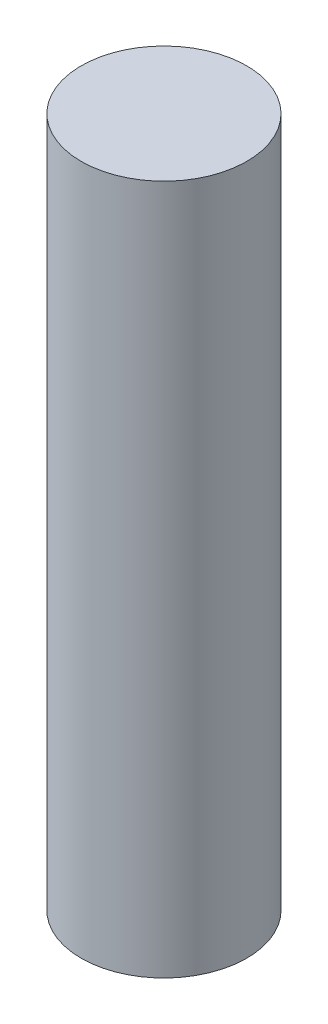
ISO-10303-21;
HEADER;
FILE_DESCRIPTION(('STEP AP214'),'2;1');
FILE_NAME('part.step','',(''),(''),'','','');
FILE_SCHEMA(('AUTOMOTIVE_DESIGN { 1 0 10303 214 1 1 1 1 }'));
ENDSEC;
DATA;
#1=APPLICATION_CONTEXT('core data for automotive mechanical design processes');
#2=APPLICATION_PROTOCOL_DEFINITION('international standard','automotive_design',2000,#1);
#3=PRODUCT_CONTEXT('',#1,'mechanical');
#4=PRODUCT('Part','Part','',(#3));
#5=PRODUCT_RELATED_PRODUCT_CATEGORY('part','',(#4));
#6=PRODUCT_DEFINITION_FORMATION('','',#4);
#7=PRODUCT_DEFINITION_CONTEXT('part definition',#1,'design');
#8=PRODUCT_DEFINITION('design','',#6,#7);
#9=PRODUCT_DEFINITION_SHAPE('','',#8);
#10=(LENGTH_UNIT() NAMED_UNIT(*) SI_UNIT(.MILLI.,.METRE.));
#11=(NAMED_UNIT(*) PLANE_ANGLE_UNIT() SI_UNIT($,.RADIAN.));
#12=(NAMED_UNIT(*) SI_UNIT($,.STERADIAN.) SOLID_ANGLE_UNIT());
#13=UNCERTAINTY_MEASURE_WITH_UNIT(LENGTH_MEASURE(1.E-05),#10,'distance_accuracy_value','');
#14=(GEOMETRIC_REPRESENTATION_CONTEXT(3) GLOBAL_UNCERTAINTY_ASSIGNED_CONTEXT((#13)) GLOBAL_UNIT_ASSIGNED_CONTEXT((#10,
#11,#12)) REPRESENTATION_CONTEXT('',''));
#15=CARTESIAN_POINT('',(0.,0.,0.));
#16=DIRECTION('',(0.,0.,1.));
#17=DIRECTION('',(1.,0.,0.));
#18=AXIS2_PLACEMENT_3D('',#15,#16,#17);
#19=CARTESIAN_POINT('',(0.,5.,0.));
#20=DIRECTION('',(0.,-1.,0.));
#21=DIRECTION('',(0.,0.,-1.));
#22=AXIS2_PLACEMENT_3D('',#19,#20,#21);
#23=CYLINDRICAL_SURFACE('',#22,0.6);
#24=CARTESIAN_POINT('',(0.,5.,0.));
#25=DIRECTION('',(0.,1.,0.));
#26=DIRECTION('',(0.,0.,1.));
#27=AXIS2_PLACEMENT_3D('',#24,#25,#26);
#28=CIRCLE('',#27,0.6);
#29=CARTESIAN_POINT('',(0.,5.,0.6));
#30=VERTEX_POINT('',#29);
#31=EDGE_CURVE('E10',#30,#30,#28,.T.);
#32=ORIENTED_EDGE('',*,*,#31,.F.);
#33=EDGE_LOOP('',(#32));
#34=FACE_BOUND('',#33,.T.);
#35=CARTESIAN_POINT('',(0.,0.,0.));
#36=DIRECTION('',(0.,1.,0.));
#37=DIRECTION('',(0.,0.,1.));
#38=AXIS2_PLACEMENT_3D('',#35,#36,#37);
#39=CIRCLE('',#38,0.6);
#40=CARTESIAN_POINT('',(0.,0.,0.6));
#41=VERTEX_POINT('',#40);
#42=EDGE_CURVE('E40',#41,#41,#39,.T.);
#43=ORIENTED_EDGE('',*,*,#42,.T.);
#44=EDGE_LOOP('',(#43));
#45=FACE_BOUND('',#44,.T.);
#46=ADVANCED_FACE('F37',(#34,#45),#23,.T.);
#47=CARTESIAN_POINT('',(0.,5.,0.));
#48=DIRECTION('',(0.,1.,0.));
#49=DIRECTION('',(0.,0.,1.));
#50=AXIS2_PLACEMENT_3D('',#47,#48,#49);
#51=PLANE('',#50);
#52=ORIENTED_EDGE('',*,*,#31,.T.);
#53=EDGE_LOOP('',(#52));
#54=FACE_BOUND('',#53,.T.);
#55=ADVANCED_FACE('F54',(#54),#51,.T.);
#56=CARTESIAN_POINT('',(0.,0.,0.));
#57=DIRECTION('',(0.,1.,0.));
#58=DIRECTION('',(0.,0.,1.));
#59=AXIS2_PLACEMENT_3D('',#56,#57,#58);
#60=PLANE('',#59);
#61=ORIENTED_EDGE('',*,*,#42,.F.);
#62=EDGE_LOOP('',(#61));
#63=FACE_BOUND('',#62,.T.);
#64=ADVANCED_FACE('F52',(#63),#60,.F.);
#65=CLOSED_SHELL('',(#46,#55,#64));
#66=MANIFOLD_SOLID_BREP('B2',#65);
#67=ADVANCED_BREP_SHAPE_REPRESENTATION('',(#18,#66),#14);
#68=SHAPE_DEFINITION_REPRESENTATION(#9,#67);
ENDSEC;
END-ISO-10303-21;
